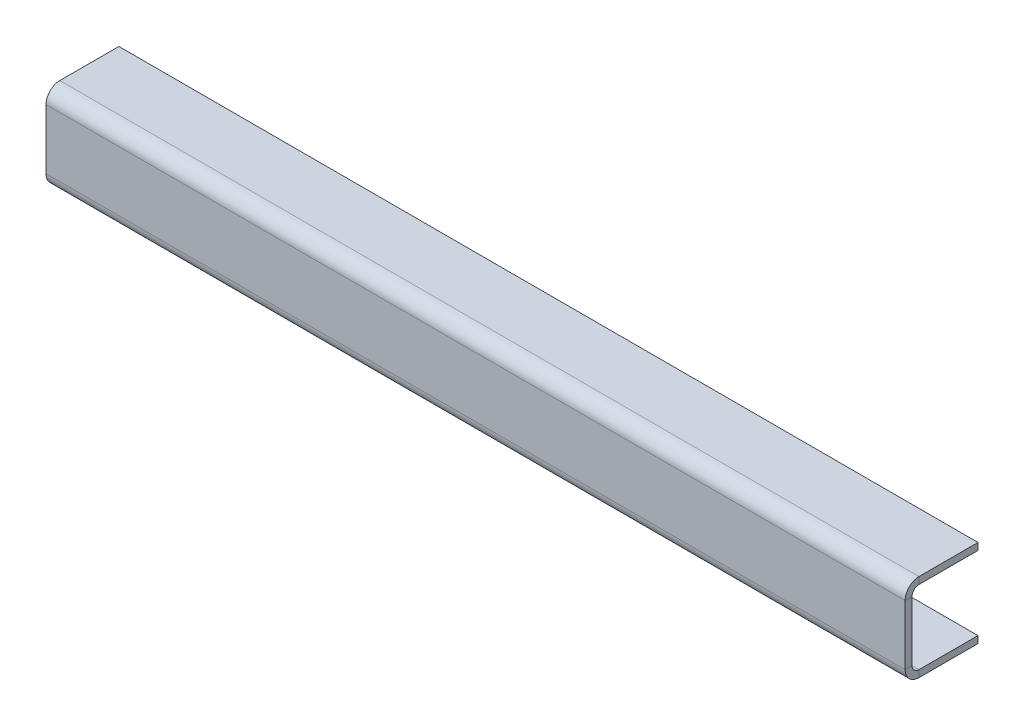
ISO-10303-21;
HEADER;
FILE_DESCRIPTION(('STEP AP214'),'2;1');
FILE_NAME('part.step','',(''),(''),'','','');
FILE_SCHEMA(('AUTOMOTIVE_DESIGN { 1 0 10303 214 1 1 1 1 }'));
ENDSEC;
DATA;
#1=APPLICATION_CONTEXT('core data for automotive mechanical design processes');
#2=APPLICATION_PROTOCOL_DEFINITION('international standard','automotive_design',2000,#1);
#3=PRODUCT_CONTEXT('',#1,'mechanical');
#4=PRODUCT('Part','Part','',(#3));
#5=PRODUCT_RELATED_PRODUCT_CATEGORY('part','',(#4));
#6=PRODUCT_DEFINITION_FORMATION('','',#4);
#7=PRODUCT_DEFINITION_CONTEXT('part definition',#1,'design');
#8=PRODUCT_DEFINITION('design','',#6,#7);
#9=PRODUCT_DEFINITION_SHAPE('','',#8);
#10=(LENGTH_UNIT() NAMED_UNIT(*) SI_UNIT(.MILLI.,.METRE.));
#11=(NAMED_UNIT(*) PLANE_ANGLE_UNIT() SI_UNIT($,.RADIAN.));
#12=(NAMED_UNIT(*) SI_UNIT($,.STERADIAN.) SOLID_ANGLE_UNIT());
#13=UNCERTAINTY_MEASURE_WITH_UNIT(LENGTH_MEASURE(1.E-05),#10,'distance_accuracy_value','');
#14=(GEOMETRIC_REPRESENTATION_CONTEXT(3) GLOBAL_UNCERTAINTY_ASSIGNED_CONTEXT((#13)) GLOBAL_UNIT_ASSIGNED_CONTEXT((#10,
#11,#12)) REPRESENTATION_CONTEXT('',''));
#15=CARTESIAN_POINT('',(0.,0.,0.));
#16=DIRECTION('',(0.,0.,1.));
#17=DIRECTION('',(1.,0.,0.));
#18=AXIS2_PLACEMENT_3D('',#15,#16,#17);
#19=CARTESIAN_POINT('',(393.7,0.,-3.175));
#20=DIRECTION('',(1.,0.,0.));
#21=DIRECTION('',(0.,0.,-1.));
#22=AXIS2_PLACEMENT_3D('',#19,#20,#21);
#23=PLANE('',#22);
#24=DIRECTION('',(0.,-1.,0.));
#25=VECTOR('',#24,1.);
#26=CARTESIAN_POINT('',(393.7,0.,-3.175));
#27=LINE('',#26,#25);
#28=CARTESIAN_POINT('',(393.7,0.,-3.175));
#29=VERTEX_POINT('',#28);
#30=CARTESIAN_POINT('',(393.7,-3.175,-3.175));
#31=VERTEX_POINT('',#30);
#32=EDGE_CURVE('E11',#29,#31,#27,.T.);
#33=ORIENTED_EDGE('',*,*,#32,.F.);
#34=CARTESIAN_POINT('',(393.7,3.175,-3.175));
#35=DIRECTION('',(1.,0.,0.));
#36=DIRECTION('',(0.,0.,-1.));
#37=AXIS2_PLACEMENT_3D('',#34,#35,#36);
#38=CIRCLE('',#37,3.175);
#39=CARTESIAN_POINT('',(393.7,3.175,0.));
#40=VERTEX_POINT('',#39);
#41=EDGE_CURVE('E145',#29,#40,#38,.F.);
#42=ORIENTED_EDGE('',*,*,#41,.T.);
#43=DIRECTION('',(0.,0.,-1.));
#44=VECTOR('',#43,1.);
#45=CARTESIAN_POINT('',(393.7,3.175,3.175));
#46=LINE('',#45,#44);
#47=CARTESIAN_POINT('',(393.7,3.175,3.175));
#48=VERTEX_POINT('',#47);
#49=EDGE_CURVE('E43',#48,#40,#46,.T.);
#50=ORIENTED_EDGE('',*,*,#49,.F.);
#51=CARTESIAN_POINT('',(393.7,3.175,-3.175));
#52=DIRECTION('',(1.,0.,0.));
#53=DIRECTION('',(0.,0.,-1.));
#54=AXIS2_PLACEMENT_3D('',#51,#52,#53);
#55=CIRCLE('',#54,6.35);
#56=EDGE_CURVE('E239',#31,#48,#55,.F.);
#57=ORIENTED_EDGE('',*,*,#56,.F.);
#58=EDGE_LOOP('',(#33,#42,#50,#57));
#59=FACE_BOUND('',#58,.T.);
#60=ADVANCED_FACE('F35',(#59),#23,.T.);
#61=CARTESIAN_POINT('',(393.7,3.175,3.175));
#62=DIRECTION('',(1.,0.,0.));
#63=DIRECTION('',(0.,0.,-1.));
#64=AXIS2_PLACEMENT_3D('',#61,#62,#63);
#65=PLANE('',#64);
#66=DIRECTION('',(0.,0.,1.));
#67=VECTOR('',#66,1.);
#68=CARTESIAN_POINT('',(393.7,0.,0.));
#69=LINE('',#68,#67);
#70=CARTESIAN_POINT('',(393.7,0.,-30.226));
#71=VERTEX_POINT('',#70);
#72=EDGE_CURVE('E150',#71,#29,#69,.T.);
#73=ORIENTED_EDGE('',*,*,#72,.T.);
#74=ORIENTED_EDGE('',*,*,#32,.T.);
#75=DIRECTION('',(0.,0.,-1.));
#76=VECTOR('',#75,1.);
#77=CARTESIAN_POINT('',(393.7,-3.175,0.));
#78=LINE('',#77,#76);
#79=CARTESIAN_POINT('',(393.7,-3.175,-30.226));
#80=VERTEX_POINT('',#79);
#81=EDGE_CURVE('E252',#80,#31,#78,.F.);
#82=ORIENTED_EDGE('',*,*,#81,.F.);
#83=DIRECTION('',(0.,-1.,0.));
#84=VECTOR('',#83,1.);
#85=CARTESIAN_POINT('',(393.7,0.,-30.226));
#86=LINE('',#85,#84);
#87=EDGE_CURVE('E254',#71,#80,#86,.T.);
#88=ORIENTED_EDGE('',*,*,#87,.F.);
#89=EDGE_LOOP('',(#73,#74,#82,#88));
#90=FACE_BOUND('',#89,.T.);
#91=ADVANCED_FACE('F265',(#90),#65,.T.);
#92=CARTESIAN_POINT('',(0.,3.175,0.));
#93=DIRECTION('',(-1.,0.,0.));
#94=DIRECTION('',(0.,0.,1.));
#95=AXIS2_PLACEMENT_3D('',#92,#93,#94);
#96=PLANE('',#95);
#97=DIRECTION('',(0.,0.,1.));
#98=VECTOR('',#97,1.);
#99=CARTESIAN_POINT('',(0.,3.175,0.));
#100=LINE('',#99,#98);
#101=CARTESIAN_POINT('',(0.,3.175,0.));
#102=VERTEX_POINT('',#101);
#103=CARTESIAN_POINT('',(0.,3.175,3.175));
#104=VERTEX_POINT('',#103);
#105=EDGE_CURVE('E143',#102,#104,#100,.T.);
#106=ORIENTED_EDGE('',*,*,#105,.F.);
#107=CARTESIAN_POINT('',(0.,3.175,-3.175));
#108=DIRECTION('',(1.,0.,0.));
#109=DIRECTION('',(0.,0.,-1.));
#110=AXIS2_PLACEMENT_3D('',#107,#108,#109);
#111=CIRCLE('',#110,3.175);
#112=CARTESIAN_POINT('',(0.,0.,-3.175));
#113=VERTEX_POINT('',#112);
#114=EDGE_CURVE('E157',#113,#102,#111,.F.);
#115=ORIENTED_EDGE('',*,*,#114,.F.);
#116=DIRECTION('',(0.,1.,0.));
#117=VECTOR('',#116,1.);
#118=CARTESIAN_POINT('',(0.,-3.175,-3.175));
#119=LINE('',#118,#117);
#120=CARTESIAN_POINT('',(0.,-3.175,-3.175));
#121=VERTEX_POINT('',#120);
#122=EDGE_CURVE('E230',#121,#113,#119,.T.);
#123=ORIENTED_EDGE('',*,*,#122,.F.);
#124=CARTESIAN_POINT('',(0.,3.175,-3.175));
#125=DIRECTION('',(1.,0.,0.));
#126=DIRECTION('',(0.,0.,-1.));
#127=AXIS2_PLACEMENT_3D('',#124,#125,#126);
#128=CIRCLE('',#127,6.35);
#129=EDGE_CURVE('E184',#121,#104,#128,.F.);
#130=ORIENTED_EDGE('',*,*,#129,.T.);
#131=EDGE_LOOP('',(#106,#115,#123,#130));
#132=FACE_BOUND('',#131,.T.);
#133=ADVANCED_FACE('F244',(#132),#96,.T.);
#134=CARTESIAN_POINT('',(0.,-3.175,-3.175));
#135=DIRECTION('',(-1.,0.,0.));
#136=DIRECTION('',(0.,0.,1.));
#137=AXIS2_PLACEMENT_3D('',#134,#135,#136);
#138=PLANE('',#137);
#139=DIRECTION('',(0.,1.,0.));
#140=VECTOR('',#139,1.);
#141=CARTESIAN_POINT('',(0.,0.,0.));
#142=LINE('',#141,#140);
#143=CARTESIAN_POINT('',(0.,30.607,0.));
#144=VERTEX_POINT('',#143);
#145=EDGE_CURVE('E197',#102,#144,#142,.T.);
#146=ORIENTED_EDGE('',*,*,#145,.F.);
#147=ORIENTED_EDGE('',*,*,#105,.T.);
#148=DIRECTION('',(0.,1.,0.));
#149=VECTOR('',#148,1.);
#150=CARTESIAN_POINT('',(0.,0.,3.175));
#151=LINE('',#150,#149);
#152=CARTESIAN_POINT('',(0.,30.607,3.175));
#153=VERTEX_POINT('',#152);
#154=EDGE_CURVE('E182',#104,#153,#151,.T.);
#155=ORIENTED_EDGE('',*,*,#154,.T.);
#156=DIRECTION('',(0.,0.,-1.));
#157=VECTOR('',#156,1.);
#158=CARTESIAN_POINT('',(0.,30.607,3.175));
#159=LINE('',#158,#157);
#160=EDGE_CURVE('E92',#153,#144,#159,.T.);
#161=ORIENTED_EDGE('',*,*,#160,.T.);
#162=EDGE_LOOP('',(#146,#147,#155,#161));
#163=FACE_BOUND('',#162,.T.);
#164=ADVANCED_FACE('F232',(#163),#138,.T.);
#165=CARTESIAN_POINT('',(393.7,30.607,0.));
#166=DIRECTION('',(1.,0.,0.));
#167=DIRECTION('',(0.,0.,-1.));
#168=AXIS2_PLACEMENT_3D('',#165,#166,#167);
#169=PLANE('',#168);
#170=DIRECTION('',(0.,0.,1.));
#171=VECTOR('',#170,1.);
#172=CARTESIAN_POINT('',(393.7,30.607,0.));
#173=LINE('',#172,#171);
#174=CARTESIAN_POINT('',(393.7,30.607,0.));
#175=VERTEX_POINT('',#174);
#176=CARTESIAN_POINT('',(393.7,30.607,3.175));
#177=VERTEX_POINT('',#176);
#178=EDGE_CURVE('E228',#175,#177,#173,.T.);
#179=ORIENTED_EDGE('',*,*,#178,.F.);
#180=CARTESIAN_POINT('',(393.7,30.607,-3.175));
#181=DIRECTION('',(1.,0.,0.));
#182=DIRECTION('',(0.,0.,-1.));
#183=AXIS2_PLACEMENT_3D('',#180,#181,#182);
#184=CIRCLE('',#183,3.175);
#185=CARTESIAN_POINT('',(393.7,33.782,-3.175));
#186=VERTEX_POINT('',#185);
#187=EDGE_CURVE('E165',#175,#186,#184,.F.);
#188=ORIENTED_EDGE('',*,*,#187,.T.);
#189=DIRECTION('',(0.,-1.,0.));
#190=VECTOR('',#189,1.);
#191=CARTESIAN_POINT('',(393.7,36.957,-3.175));
#192=LINE('',#191,#190);
#193=CARTESIAN_POINT('',(393.7,36.957,-3.175));
#194=VERTEX_POINT('',#193);
#195=EDGE_CURVE('E51',#194,#186,#192,.T.);
#196=ORIENTED_EDGE('',*,*,#195,.F.);
#197=CARTESIAN_POINT('',(393.7,30.607,-3.175));
#198=DIRECTION('',(1.,0.,0.));
#199=DIRECTION('',(0.,0.,-1.));
#200=AXIS2_PLACEMENT_3D('',#197,#198,#199);
#201=CIRCLE('',#200,6.35);
#202=EDGE_CURVE('E256',#177,#194,#201,.F.);
#203=ORIENTED_EDGE('',*,*,#202,.F.);
#204=EDGE_LOOP('',(#179,#188,#196,#203));
#205=FACE_BOUND('',#204,.T.);
#206=ADVANCED_FACE('F291',(#205),#169,.T.);
#207=CARTESIAN_POINT('',(393.7,36.957,-3.175));
#208=DIRECTION('',(1.,0.,0.));
#209=DIRECTION('',(0.,0.,-1.));
#210=AXIS2_PLACEMENT_3D('',#207,#208,#209);
#211=PLANE('',#210);
#212=DIRECTION('',(0.,1.,0.));
#213=VECTOR('',#212,1.);
#214=CARTESIAN_POINT('',(393.7,0.,0.));
#215=LINE('',#214,#213);
#216=EDGE_CURVE('E135',#40,#175,#215,.T.);
#217=ORIENTED_EDGE('',*,*,#216,.T.);
#218=ORIENTED_EDGE('',*,*,#178,.T.);
#219=DIRECTION('',(0.,1.,0.));
#220=VECTOR('',#219,1.);
#221=CARTESIAN_POINT('',(393.7,0.,3.175));
#222=LINE('',#221,#220);
#223=EDGE_CURVE('E138',#48,#177,#222,.T.);
#224=ORIENTED_EDGE('',*,*,#223,.F.);
#225=ORIENTED_EDGE('',*,*,#49,.T.);
#226=EDGE_LOOP('',(#217,#218,#224,#225));
#227=FACE_BOUND('',#226,.T.);
#228=ADVANCED_FACE('F133',(#227),#211,.T.);
#229=CARTESIAN_POINT('',(0.,33.782,-3.175));
#230=DIRECTION('',(-1.,0.,0.));
#231=DIRECTION('',(0.,0.,1.));
#232=AXIS2_PLACEMENT_3D('',#229,#230,#231);
#233=PLANE('',#232);
#234=DIRECTION('',(0.,1.,0.));
#235=VECTOR('',#234,1.);
#236=CARTESIAN_POINT('',(0.,33.782,-3.175));
#237=LINE('',#236,#235);
#238=CARTESIAN_POINT('',(0.,33.782,-3.175));
#239=VERTEX_POINT('',#238);
#240=CARTESIAN_POINT('',(0.,36.957,-3.175));
#241=VERTEX_POINT('',#240);
#242=EDGE_CURVE('E99',#239,#241,#237,.T.);
#243=ORIENTED_EDGE('',*,*,#242,.F.);
#244=CARTESIAN_POINT('',(0.,30.607,-3.175));
#245=DIRECTION('',(1.,0.,0.));
#246=DIRECTION('',(0.,0.,-1.));
#247=AXIS2_PLACEMENT_3D('',#244,#245,#246);
#248=CIRCLE('',#247,3.175);
#249=EDGE_CURVE('E199',#144,#239,#248,.F.);
#250=ORIENTED_EDGE('',*,*,#249,.F.);
#251=ORIENTED_EDGE('',*,*,#160,.F.);
#252=CARTESIAN_POINT('',(0.,30.607,-3.175));
#253=DIRECTION('',(1.,0.,0.));
#254=DIRECTION('',(0.,0.,-1.));
#255=AXIS2_PLACEMENT_3D('',#252,#253,#254);
#256=CIRCLE('',#255,6.35);
#257=EDGE_CURVE('E180',#153,#241,#256,.F.);
#258=ORIENTED_EDGE('',*,*,#257,.T.);
#259=EDGE_LOOP('',(#243,#250,#251,#258));
#260=FACE_BOUND('',#259,.T.);
#261=ADVANCED_FACE('F297',(#260),#233,.T.);
#262=CARTESIAN_POINT('',(0.,30.607,3.175));
#263=DIRECTION('',(-1.,0.,0.));
#264=DIRECTION('',(0.,0.,1.));
#265=AXIS2_PLACEMENT_3D('',#262,#263,#264);
#266=PLANE('',#265);
#267=DIRECTION('',(0.,0.,-1.));
#268=VECTOR('',#267,1.);
#269=CARTESIAN_POINT('',(0.,33.782,0.));
#270=LINE('',#269,#268);
#271=CARTESIAN_POINT('',(0.,33.782,-30.226));
#272=VERTEX_POINT('',#271);
#273=EDGE_CURVE('E171',#239,#272,#270,.T.);
#274=ORIENTED_EDGE('',*,*,#273,.F.);
#275=ORIENTED_EDGE('',*,*,#242,.T.);
#276=DIRECTION('',(0.,0.,-1.));
#277=VECTOR('',#276,1.);
#278=CARTESIAN_POINT('',(0.,36.957,0.));
#279=LINE('',#278,#277);
#280=CARTESIAN_POINT('',(0.,36.957,-30.226));
#281=VERTEX_POINT('',#280);
#282=EDGE_CURVE('E177',#241,#281,#279,.T.);
#283=ORIENTED_EDGE('',*,*,#282,.T.);
#284=DIRECTION('',(0.,-1.,0.));
#285=VECTOR('',#284,1.);
#286=CARTESIAN_POINT('',(0.,36.957,-30.226));
#287=LINE('',#286,#285);
#288=EDGE_CURVE('E174',#281,#272,#287,.T.);
#289=ORIENTED_EDGE('',*,*,#288,.T.);
#290=EDGE_LOOP('',(#274,#275,#283,#289));
#291=FACE_BOUND('',#290,.T.);
#292=ADVANCED_FACE('F300',(#291),#266,.T.);
#293=CARTESIAN_POINT('',(393.7,33.782,0.));
#294=DIRECTION('',(0.,1.,0.));
#295=DIRECTION('',(0.,0.,1.));
#296=AXIS2_PLACEMENT_3D('',#293,#294,#295);
#297=PLANE('',#296);
#298=ORIENTED_EDGE('',*,*,#273,.T.);
#299=DIRECTION('',(-1.,0.,0.));
#300=VECTOR('',#299,1.);
#301=CARTESIAN_POINT('',(393.7,33.782,-30.226));
#302=LINE('',#301,#300);
#303=CARTESIAN_POINT('',(393.7,33.782,-30.226));
#304=VERTEX_POINT('',#303);
#305=EDGE_CURVE('E223',#304,#272,#302,.T.);
#306=ORIENTED_EDGE('',*,*,#305,.F.);
#307=DIRECTION('',(0.,0.,-1.));
#308=VECTOR('',#307,1.);
#309=CARTESIAN_POINT('',(393.7,33.782,0.));
#310=LINE('',#309,#308);
#311=EDGE_CURVE('E105',#186,#304,#310,.T.);
#312=ORIENTED_EDGE('',*,*,#311,.F.);
#313=DIRECTION('',(-1.,0.,0.));
#314=VECTOR('',#313,1.);
#315=CARTESIAN_POINT('',(393.7,33.782,-3.175));
#316=LINE('',#315,#314);
#317=EDGE_CURVE('E167',#186,#239,#316,.T.);
#318=ORIENTED_EDGE('',*,*,#317,.T.);
#319=EDGE_LOOP('',(#298,#306,#312,#318));
#320=FACE_BOUND('',#319,.T.);
#321=ADVANCED_FACE('F303',(#320),#297,.F.);
#322=CARTESIAN_POINT('',(393.7,36.957,-30.226));
#323=DIRECTION('',(0.,0.,-1.));
#324=DIRECTION('',(-1.,0.,0.));
#325=AXIS2_PLACEMENT_3D('',#322,#323,#324);
#326=PLANE('',#325);
#327=ORIENTED_EDGE('',*,*,#288,.F.);
#328=DIRECTION('',(-1.,0.,0.));
#329=VECTOR('',#328,1.);
#330=CARTESIAN_POINT('',(393.7,36.957,-30.226));
#331=LINE('',#330,#329);
#332=CARTESIAN_POINT('',(393.7,36.957,-30.226));
#333=VERTEX_POINT('',#332);
#334=EDGE_CURVE('E221',#333,#281,#331,.T.);
#335=ORIENTED_EDGE('',*,*,#334,.F.);
#336=DIRECTION('',(0.,-1.,0.));
#337=VECTOR('',#336,1.);
#338=CARTESIAN_POINT('',(393.7,36.957,-30.226));
#339=LINE('',#338,#337);
#340=EDGE_CURVE('E511',#333,#304,#339,.T.);
#341=ORIENTED_EDGE('',*,*,#340,.T.);
#342=ORIENTED_EDGE('',*,*,#305,.T.);
#343=EDGE_LOOP('',(#327,#335,#341,#342));
#344=FACE_BOUND('',#343,.T.);
#345=ADVANCED_FACE('F307',(#344),#326,.T.);
#346=CARTESIAN_POINT('',(393.7,36.957,0.));
#347=DIRECTION('',(0.,1.,0.));
#348=DIRECTION('',(0.,0.,1.));
#349=AXIS2_PLACEMENT_3D('',#346,#347,#348);
#350=PLANE('',#349);
#351=ORIENTED_EDGE('',*,*,#282,.F.);
#352=DIRECTION('',(-1.,0.,0.));
#353=VECTOR('',#352,1.);
#354=CARTESIAN_POINT('',(393.7,36.957,-3.175));
#355=LINE('',#354,#353);
#356=EDGE_CURVE('E218',#194,#241,#355,.T.);
#357=ORIENTED_EDGE('',*,*,#356,.F.);
#358=DIRECTION('',(0.,0.,-1.));
#359=VECTOR('',#358,1.);
#360=CARTESIAN_POINT('',(393.7,36.957,0.));
#361=LINE('',#360,#359);
#362=EDGE_CURVE('E513',#194,#333,#361,.T.);
#363=ORIENTED_EDGE('',*,*,#362,.T.);
#364=ORIENTED_EDGE('',*,*,#334,.T.);
#365=EDGE_LOOP('',(#351,#357,#363,#364));
#366=FACE_BOUND('',#365,.T.);
#367=ADVANCED_FACE('F311',(#366),#350,.T.);
#368=CARTESIAN_POINT('',(393.7,30.607,-3.175));
#369=DIRECTION('',(-1.,0.,0.));
#370=DIRECTION('',(0.,0.,1.));
#371=AXIS2_PLACEMENT_3D('',#368,#369,#370);
#372=CYLINDRICAL_SURFACE('',#371,6.35);
#373=ORIENTED_EDGE('',*,*,#257,.F.);
#374=DIRECTION('',(-1.,0.,0.));
#375=VECTOR('',#374,1.);
#376=CARTESIAN_POINT('',(393.7,30.607,3.175));
#377=LINE('',#376,#375);
#378=EDGE_CURVE('E215',#177,#153,#377,.T.);
#379=ORIENTED_EDGE('',*,*,#378,.F.);
#380=ORIENTED_EDGE('',*,*,#202,.T.);
#381=ORIENTED_EDGE('',*,*,#356,.T.);
#382=EDGE_LOOP('',(#373,#379,#380,#381));
#383=FACE_BOUND('',#382,.T.);
#384=ADVANCED_FACE('F315',(#383),#372,.T.);
#385=CARTESIAN_POINT('',(393.7,0.,3.175));
#386=DIRECTION('',(0.,0.,1.));
#387=DIRECTION('',(1.,0.,0.));
#388=AXIS2_PLACEMENT_3D('',#385,#386,#387);
#389=PLANE('',#388);
#390=ORIENTED_EDGE('',*,*,#154,.F.);
#391=DIRECTION('',(-1.,0.,0.));
#392=VECTOR('',#391,1.);
#393=CARTESIAN_POINT('',(393.7,3.175,3.175));
#394=LINE('',#393,#392);
#395=EDGE_CURVE('E212',#48,#104,#394,.T.);
#396=ORIENTED_EDGE('',*,*,#395,.F.);
#397=ORIENTED_EDGE('',*,*,#223,.T.);
#398=ORIENTED_EDGE('',*,*,#378,.T.);
#399=EDGE_LOOP('',(#390,#396,#397,#398));
#400=FACE_BOUND('',#399,.T.);
#401=ADVANCED_FACE('F241',(#400),#389,.T.);
#402=CARTESIAN_POINT('',(393.7,3.175,-3.175));
#403=DIRECTION('',(-1.,0.,0.));
#404=DIRECTION('',(0.,0.,1.));
#405=AXIS2_PLACEMENT_3D('',#402,#403,#404);
#406=CYLINDRICAL_SURFACE('',#405,6.35);
#407=ORIENTED_EDGE('',*,*,#129,.F.);
#408=DIRECTION('',(-1.,0.,0.));
#409=VECTOR('',#408,1.);
#410=CARTESIAN_POINT('',(393.7,-3.175,-3.175));
#411=LINE('',#410,#409);
#412=EDGE_CURVE('E209',#31,#121,#411,.T.);
#413=ORIENTED_EDGE('',*,*,#412,.F.);
#414=ORIENTED_EDGE('',*,*,#56,.T.);
#415=ORIENTED_EDGE('',*,*,#395,.T.);
#416=EDGE_LOOP('',(#407,#413,#414,#415));
#417=FACE_BOUND('',#416,.T.);
#418=ADVANCED_FACE('F237',(#417),#406,.T.);
#419=CARTESIAN_POINT('',(393.7,-3.175,0.));
#420=DIRECTION('',(0.,-1.,0.));
#421=DIRECTION('',(0.,0.,-1.));
#422=AXIS2_PLACEMENT_3D('',#419,#420,#421);
#423=PLANE('',#422);
#424=DIRECTION('',(0.,0.,-1.));
#425=VECTOR('',#424,1.);
#426=CARTESIAN_POINT('',(0.,-3.175,0.));
#427=LINE('',#426,#425);
#428=CARTESIAN_POINT('',(0.,-3.175,-30.226));
#429=VERTEX_POINT('',#428);
#430=EDGE_CURVE('E187',#429,#121,#427,.F.);
#431=ORIENTED_EDGE('',*,*,#430,.F.);
#432=DIRECTION('',(-1.,0.,0.));
#433=VECTOR('',#432,1.);
#434=CARTESIAN_POINT('',(393.7,-3.175,-30.226));
#435=LINE('',#434,#433);
#436=EDGE_CURVE('E207',#80,#429,#435,.T.);
#437=ORIENTED_EDGE('',*,*,#436,.F.);
#438=ORIENTED_EDGE('',*,*,#81,.T.);
#439=ORIENTED_EDGE('',*,*,#412,.T.);
#440=EDGE_LOOP('',(#431,#437,#438,#439));
#441=FACE_BOUND('',#440,.T.);
#442=ADVANCED_FACE('F250',(#441),#423,.T.);
#443=CARTESIAN_POINT('',(393.7,0.,-30.226));
#444=DIRECTION('',(0.,0.,-1.));
#445=DIRECTION('',(-1.,0.,0.));
#446=AXIS2_PLACEMENT_3D('',#443,#444,#445);
#447=PLANE('',#446);
#448=DIRECTION('',(0.,-1.,0.));
#449=VECTOR('',#448,1.);
#450=CARTESIAN_POINT('',(0.,0.,-30.226));
#451=LINE('',#450,#449);
#452=CARTESIAN_POINT('',(0.,0.,-30.226));
#453=VERTEX_POINT('',#452);
#454=EDGE_CURVE('E190',#453,#429,#451,.T.);
#455=ORIENTED_EDGE('',*,*,#454,.F.);
#456=DIRECTION('',(-1.,0.,0.));
#457=VECTOR('',#456,1.);
#458=CARTESIAN_POINT('',(393.7,0.,-30.226));
#459=LINE('',#458,#457);
#460=EDGE_CURVE('E205',#71,#453,#459,.T.);
#461=ORIENTED_EDGE('',*,*,#460,.F.);
#462=ORIENTED_EDGE('',*,*,#87,.T.);
#463=ORIENTED_EDGE('',*,*,#436,.T.);
#464=EDGE_LOOP('',(#455,#461,#462,#463));
#465=FACE_BOUND('',#464,.T.);
#466=ADVANCED_FACE('F271',(#465),#447,.T.);
#467=CARTESIAN_POINT('',(393.7,0.,0.));
#468=DIRECTION('',(0.,-1.,0.));
#469=DIRECTION('',(0.,0.,-1.));
#470=AXIS2_PLACEMENT_3D('',#467,#468,#469);
#471=PLANE('',#470);
#472=DIRECTION('',(0.,0.,1.));
#473=VECTOR('',#472,1.);
#474=CARTESIAN_POINT('',(0.,0.,0.));
#475=LINE('',#474,#473);
#476=EDGE_CURVE('E193',#453,#113,#475,.T.);
#477=ORIENTED_EDGE('',*,*,#476,.T.);
#478=DIRECTION('',(-1.,0.,0.));
#479=VECTOR('',#478,1.);
#480=CARTESIAN_POINT('',(393.7,0.,-3.175));
#481=LINE('',#480,#479);
#482=EDGE_CURVE('E159',#29,#113,#481,.T.);
#483=ORIENTED_EDGE('',*,*,#482,.F.);
#484=ORIENTED_EDGE('',*,*,#72,.F.);
#485=ORIENTED_EDGE('',*,*,#460,.T.);
#486=EDGE_LOOP('',(#477,#483,#484,#485));
#487=FACE_BOUND('',#486,.T.);
#488=ADVANCED_FACE('F267',(#487),#471,.F.);
#489=CARTESIAN_POINT('',(393.7,3.175,-3.175));
#490=DIRECTION('',(-1.,0.,0.));
#491=DIRECTION('',(0.,0.,1.));
#492=AXIS2_PLACEMENT_3D('',#489,#490,#491);
#493=CYLINDRICAL_SURFACE('',#492,3.175);
#494=ORIENTED_EDGE('',*,*,#114,.T.);
#495=DIRECTION('',(-1.,0.,0.));
#496=VECTOR('',#495,1.);
#497=CARTESIAN_POINT('',(393.7,3.175,0.));
#498=LINE('',#497,#496);
#499=EDGE_CURVE('E154',#40,#102,#498,.T.);
#500=ORIENTED_EDGE('',*,*,#499,.F.);
#501=ORIENTED_EDGE('',*,*,#41,.F.);
#502=ORIENTED_EDGE('',*,*,#482,.T.);
#503=EDGE_LOOP('',(#494,#500,#501,#502));
#504=FACE_BOUND('',#503,.T.);
#505=ADVANCED_FACE('F155',(#504),#493,.F.);
#506=CARTESIAN_POINT('',(393.7,0.,0.));
#507=DIRECTION('',(0.,0.,1.));
#508=DIRECTION('',(1.,0.,0.));
#509=AXIS2_PLACEMENT_3D('',#506,#507,#508);
#510=PLANE('',#509);
#511=ORIENTED_EDGE('',*,*,#145,.T.);
#512=DIRECTION('',(-1.,0.,0.));
#513=VECTOR('',#512,1.);
#514=CARTESIAN_POINT('',(393.7,30.607,0.));
#515=LINE('',#514,#513);
#516=EDGE_CURVE('E160',#175,#144,#515,.T.);
#517=ORIENTED_EDGE('',*,*,#516,.F.);
#518=ORIENTED_EDGE('',*,*,#216,.F.);
#519=ORIENTED_EDGE('',*,*,#499,.T.);
#520=EDGE_LOOP('',(#511,#517,#518,#519));
#521=FACE_BOUND('',#520,.T.);
#522=ADVANCED_FACE('F162',(#521),#510,.F.);
#523=CARTESIAN_POINT('',(393.7,30.607,-3.175));
#524=DIRECTION('',(-1.,0.,0.));
#525=DIRECTION('',(0.,0.,1.));
#526=AXIS2_PLACEMENT_3D('',#523,#524,#525);
#527=CYLINDRICAL_SURFACE('',#526,3.175);
#528=ORIENTED_EDGE('',*,*,#249,.T.);
#529=ORIENTED_EDGE('',*,*,#317,.F.);
#530=ORIENTED_EDGE('',*,*,#187,.F.);
#531=ORIENTED_EDGE('',*,*,#516,.T.);
#532=EDGE_LOOP('',(#528,#529,#530,#531));
#533=FACE_BOUND('',#532,.T.);
#534=ADVANCED_FACE('F362',(#533),#527,.F.);
#535=CARTESIAN_POINT('',(393.7,30.607,-3.175));
#536=DIRECTION('',(1.,0.,0.));
#537=DIRECTION('',(0.,0.,-1.));
#538=AXIS2_PLACEMENT_3D('',#535,#536,#537);
#539=PLANE('',#538);
#540=ORIENTED_EDGE('',*,*,#311,.T.);
#541=ORIENTED_EDGE('',*,*,#340,.F.);
#542=ORIENTED_EDGE('',*,*,#362,.F.);
#543=ORIENTED_EDGE('',*,*,#195,.T.);
#544=EDGE_LOOP('',(#540,#541,#542,#543));
#545=FACE_BOUND('',#544,.T.);
#546=ADVANCED_FACE('F372',(#545),#539,.T.);
#547=CARTESIAN_POINT('',(0.,30.607,-3.175));
#548=DIRECTION('',(1.,0.,0.));
#549=DIRECTION('',(0.,0.,-1.));
#550=AXIS2_PLACEMENT_3D('',#547,#548,#549);
#551=PLANE('',#550);
#552=ORIENTED_EDGE('',*,*,#430,.T.);
#553=ORIENTED_EDGE('',*,*,#122,.T.);
#554=ORIENTED_EDGE('',*,*,#476,.F.);
#555=ORIENTED_EDGE('',*,*,#454,.T.);
#556=EDGE_LOOP('',(#552,#553,#554,#555));
#557=FACE_BOUND('',#556,.T.);
#558=ADVANCED_FACE('F269',(#557),#551,.F.);
#559=CLOSED_SHELL('',(#60,#91,#133,#164,#206,#228,#261,#292,#321,#345,#367,#384,#401,#418,#442,
#466,#488,#505,#522,#534,#546,#558));
#560=MANIFOLD_SOLID_BREP('B2',#559);
#561=ADVANCED_BREP_SHAPE_REPRESENTATION('',(#18,#560),#14);
#562=SHAPE_DEFINITION_REPRESENTATION(#9,#561);
ENDSEC;
END-ISO-10303-21;
